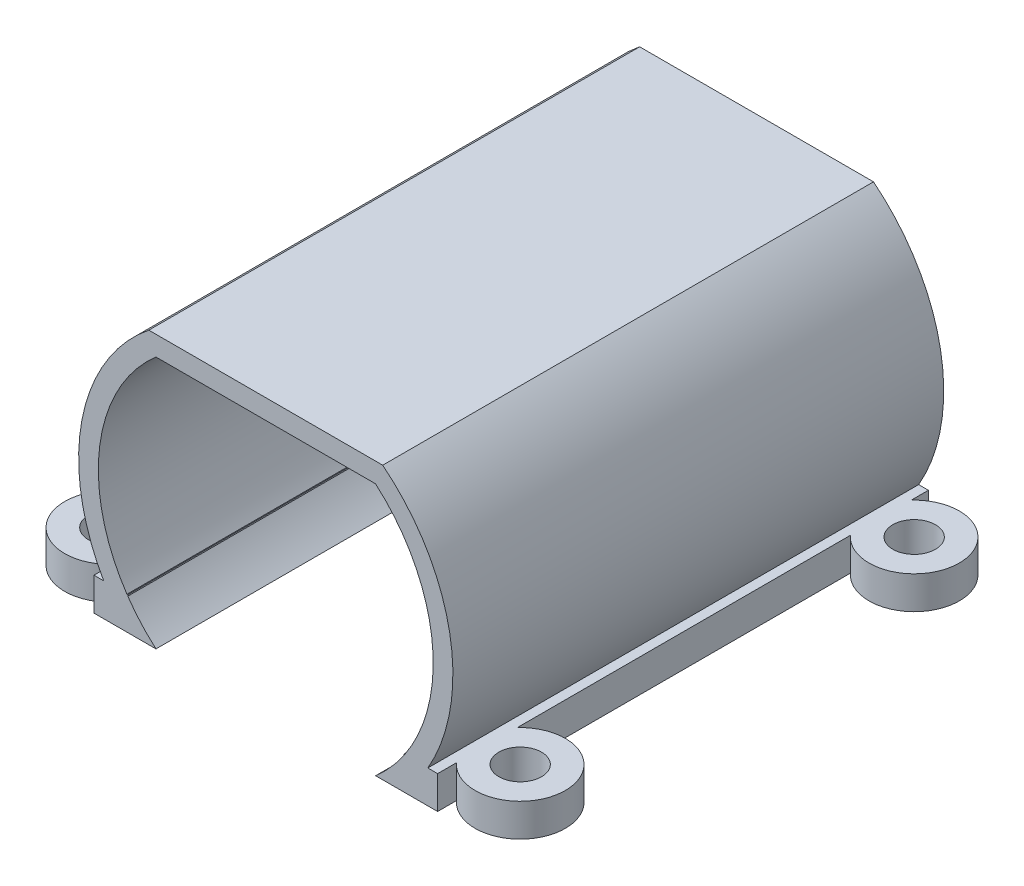
ISO-10303-21;
HEADER;
FILE_DESCRIPTION(('STEP AP214'),'2;1');
FILE_NAME('part.step','',(''),(''),'','','');
FILE_SCHEMA(('AUTOMOTIVE_DESIGN { 1 0 10303 214 1 1 1 1 }'));
ENDSEC;
DATA;
#1=APPLICATION_CONTEXT('core data for automotive mechanical design processes');
#2=APPLICATION_PROTOCOL_DEFINITION('international standard','automotive_design',2000,#1);
#3=PRODUCT_CONTEXT('',#1,'mechanical');
#4=PRODUCT('Part','Part','',(#3));
#5=PRODUCT_RELATED_PRODUCT_CATEGORY('part','',(#4));
#6=PRODUCT_DEFINITION_FORMATION('','',#4);
#7=PRODUCT_DEFINITION_CONTEXT('part definition',#1,'design');
#8=PRODUCT_DEFINITION('design','',#6,#7);
#9=PRODUCT_DEFINITION_SHAPE('','',#8);
#10=(LENGTH_UNIT() NAMED_UNIT(*) SI_UNIT(.MILLI.,.METRE.));
#11=(NAMED_UNIT(*) PLANE_ANGLE_UNIT() SI_UNIT($,.RADIAN.));
#12=(NAMED_UNIT(*) SI_UNIT($,.STERADIAN.) SOLID_ANGLE_UNIT());
#13=UNCERTAINTY_MEASURE_WITH_UNIT(LENGTH_MEASURE(1.E-05),#10,'distance_accuracy_value','');
#14=(GEOMETRIC_REPRESENTATION_CONTEXT(3) GLOBAL_UNCERTAINTY_ASSIGNED_CONTEXT((#13)) GLOBAL_UNIT_ASSIGNED_CONTEXT((#10,
#11,#12)) REPRESENTATION_CONTEXT('',''));
#15=CARTESIAN_POINT('',(0.,0.,0.));
#16=DIRECTION('',(0.,0.,1.));
#17=DIRECTION('',(1.,0.,0.));
#18=AXIS2_PLACEMENT_3D('',#15,#16,#17);
#19=CARTESIAN_POINT('',(0.,0.,30.));
#20=DIRECTION('',(0.,0.,-1.));
#21=DIRECTION('',(-1.,0.,0.));
#22=AXIS2_PLACEMENT_3D('',#19,#20,#21);
#23=CYLINDRICAL_SURFACE('',#22,11.4);
#24=DIRECTION('',(0.,0.,-1.));
#25=VECTOR('',#24,1.);
#26=CARTESIAN_POINT('',(9.8726896031426,-5.7,30.));
#27=LINE('',#26,#25);
#28=CARTESIAN_POINT('',(9.8726896031426,-5.7,30.));
#29=VERTEX_POINT('',#28);
#30=CARTESIAN_POINT('',(9.8726896031426,-5.7,0.0999999999999994));
#31=VERTEX_POINT('',#30);
#32=EDGE_CURVE('E11',#29,#31,#27,.T.);
#33=ORIENTED_EDGE('',*,*,#32,.T.);
#34=CARTESIAN_POINT('',(0.,0.,0.0999999999999994));
#35=DIRECTION('',(0.,0.,-1.));
#36=DIRECTION('',(-1.,0.,0.));
#37=AXIS2_PLACEMENT_3D('',#34,#35,#36);
#38=CIRCLE('',#37,11.4);
#39=CARTESIAN_POINT('',(7.1239034243875,8.9,0.0999999999999994));
#40=VERTEX_POINT('',#39);
#41=EDGE_CURVE('E218',#40,#31,#38,.T.);
#42=ORIENTED_EDGE('',*,*,#41,.F.);
#43=DIRECTION('',(0.,0.,-1.));
#44=VECTOR('',#43,1.);
#45=CARTESIAN_POINT('',(7.1239034243875,8.9,30.));
#46=LINE('',#45,#44);
#47=CARTESIAN_POINT('',(7.1239034243875,8.9,30.));
#48=VERTEX_POINT('',#47);
#49=EDGE_CURVE('E293',#48,#40,#46,.T.);
#50=ORIENTED_EDGE('',*,*,#49,.F.);
#51=CARTESIAN_POINT('',(0.,0.,30.));
#52=DIRECTION('',(0.,0.,1.));
#53=DIRECTION('',(1.,0.,0.));
#54=AXIS2_PLACEMENT_3D('',#51,#52,#53);
#55=CIRCLE('',#54,11.4);
#56=EDGE_CURVE('E292',#29,#48,#55,.T.);
#57=ORIENTED_EDGE('',*,*,#56,.F.);
#58=EDGE_LOOP('',(#33,#42,#50,#57));
#59=FACE_BOUND('',#58,.T.);
#60=ADVANCED_FACE('F37',(#59),#23,.T.);
#61=CARTESIAN_POINT('',(0.,0.,30.));
#62=DIRECTION('',(0.,0.,-1.));
#63=DIRECTION('',(-1.,0.,0.));
#64=AXIS2_PLACEMENT_3D('',#61,#62,#63);
#65=CYLINDRICAL_SURFACE('',#64,10.2);
#66=CARTESIAN_POINT('',(0.,0.,0.0999999999999994));
#67=DIRECTION('',(0.,0.,-1.));
#68=DIRECTION('',(-1.,0.,0.));
#69=AXIS2_PLACEMENT_3D('',#66,#67,#68);
#70=CIRCLE('',#69,10.2);
#71=CARTESIAN_POINT('',(6.68954408012983,7.7,0.0999999999999994));
#72=VERTEX_POINT('',#71);
#73=CARTESIAN_POINT('',(8.45872330792301,-5.7,0.0999999999999994));
#74=VERTEX_POINT('',#73);
#75=EDGE_CURVE('E250',#72,#74,#70,.T.);
#76=ORIENTED_EDGE('',*,*,#75,.T.);
#77=DIRECTION('',(0.,0.,-1.));
#78=VECTOR('',#77,1.);
#79=CARTESIAN_POINT('',(8.45872330792301,-5.7,30.));
#80=LINE('',#79,#78);
#81=CARTESIAN_POINT('',(8.45872330792301,-5.7,30.));
#82=VERTEX_POINT('',#81);
#83=EDGE_CURVE('E257',#74,#82,#80,.F.);
#84=ORIENTED_EDGE('',*,*,#83,.T.);
#85=CARTESIAN_POINT('',(0.,0.,30.));
#86=DIRECTION('',(0.,0.,1.));
#87=DIRECTION('',(1.,0.,0.));
#88=AXIS2_PLACEMENT_3D('',#85,#86,#87);
#89=CIRCLE('',#88,10.2);
#90=CARTESIAN_POINT('',(6.68954408012983,7.7,30.));
#91=VERTEX_POINT('',#90);
#92=EDGE_CURVE('E272',#82,#91,#89,.T.);
#93=ORIENTED_EDGE('',*,*,#92,.T.);
#94=DIRECTION('',(0.,0.,-1.));
#95=VECTOR('',#94,1.);
#96=CARTESIAN_POINT('',(6.68954408012983,7.7,30.));
#97=LINE('',#96,#95);
#98=EDGE_CURVE('E260',#91,#72,#97,.T.);
#99=ORIENTED_EDGE('',*,*,#98,.T.);
#100=EDGE_LOOP('',(#76,#84,#93,#99));
#101=FACE_BOUND('',#100,.T.);
#102=ADVANCED_FACE('F256',(#101),#65,.F.);
#103=CARTESIAN_POINT('',(-10.4676451259584,-5.7,0.0999999999999994));
#104=DIRECTION('',(-1.,0.,0.));
#105=DIRECTION('',(0.,0.,1.));
#106=AXIS2_PLACEMENT_3D('',#103,#104,#105);
#107=PLANE('',#106);
#108=DIRECTION('',(0.,-1.,0.));
#109=VECTOR('',#108,1.);
#110=CARTESIAN_POINT('',(-10.4676451259584,-5.7,1.14742512541077));
#111=LINE('',#110,#109);
#112=CARTESIAN_POINT('',(-10.4676451259584,-5.7,1.14742512541077));
#113=VERTEX_POINT('',#112);
#114=CARTESIAN_POINT('',(-10.4676451259584,-7.7,1.14742512541077));
#115=VERTEX_POINT('',#114);
#116=EDGE_CURVE('E405',#113,#115,#111,.T.);
#117=ORIENTED_EDGE('',*,*,#116,.F.);
#118=DIRECTION('',(0.,0.,-1.));
#119=VECTOR('',#118,1.);
#120=CARTESIAN_POINT('',(-10.4676451259584,-5.7,0.0999999999999994));
#121=LINE('',#120,#119);
#122=CARTESIAN_POINT('',(-10.4676451259584,-5.7,0.0999999999999994));
#123=VERTEX_POINT('',#122);
#124=EDGE_CURVE('E365',#113,#123,#121,.T.);
#125=ORIENTED_EDGE('',*,*,#124,.T.);
#126=DIRECTION('',(0.,-1.,0.));
#127=VECTOR('',#126,1.);
#128=CARTESIAN_POINT('',(-10.4676451259584,-5.7,0.0999999999999994));
#129=LINE('',#128,#127);
#130=CARTESIAN_POINT('',(-10.4676451259584,-7.7,0.0999999999999994));
#131=VERTEX_POINT('',#130);
#132=EDGE_CURVE('E351',#123,#131,#129,.T.);
#133=ORIENTED_EDGE('',*,*,#132,.T.);
#134=DIRECTION('',(0.,0.,-1.));
#135=VECTOR('',#134,1.);
#136=CARTESIAN_POINT('',(-10.4676451259584,-7.7,0.0999999999999994));
#137=LINE('',#136,#135);
#138=EDGE_CURVE('E314',#115,#131,#137,.T.);
#139=ORIENTED_EDGE('',*,*,#138,.F.);
#140=EDGE_LOOP('',(#117,#125,#133,#139));
#141=FACE_BOUND('',#140,.T.);
#142=ADVANCED_FACE('F479',(#141),#107,.T.);
#143=DIRECTION('',(0.,-1.,0.));
#144=VECTOR('',#143,1.);
#145=CARTESIAN_POINT('',(-10.4676451259584,-5.7,4.85257487458923));
#146=LINE('',#145,#144);
#147=CARTESIAN_POINT('',(-10.4676451259584,-7.7,4.85257487458923));
#148=VERTEX_POINT('',#147);
#149=CARTESIAN_POINT('',(-10.4676451259584,-5.7,4.85257487458923));
#150=VERTEX_POINT('',#149);
#151=EDGE_CURVE('E410',#148,#150,#146,.F.);
#152=ORIENTED_EDGE('',*,*,#151,.F.);
#153=CARTESIAN_POINT('',(-10.4676451259584,-7.7,25.1474251254108));
#154=VERTEX_POINT('',#153);
#155=EDGE_CURVE('E357',#154,#148,#137,.T.);
#156=ORIENTED_EDGE('',*,*,#155,.F.);
#157=DIRECTION('',(0.,-1.,0.));
#158=VECTOR('',#157,1.);
#159=CARTESIAN_POINT('',(-10.4676451259584,-5.7,25.1474251254108));
#160=LINE('',#159,#158);
#161=CARTESIAN_POINT('',(-10.4676451259584,-5.7,25.1474251254108));
#162=VERTEX_POINT('',#161);
#163=EDGE_CURVE('E390',#162,#154,#160,.T.);
#164=ORIENTED_EDGE('',*,*,#163,.F.);
#165=EDGE_CURVE('E364',#162,#150,#121,.T.);
#166=ORIENTED_EDGE('',*,*,#165,.T.);
#167=EDGE_LOOP('',(#152,#156,#164,#166));
#168=FACE_BOUND('',#167,.T.);
#169=ADVANCED_FACE('F472',(#168),#107,.T.);
#170=CARTESIAN_POINT('',(0.,0.,30.));
#171=DIRECTION('',(0.,0.,-1.));
#172=DIRECTION('',(-1.,0.,0.));
#173=AXIS2_PLACEMENT_3D('',#170,#171,#172);
#174=CYLINDRICAL_SURFACE('',#173,11.4);
#175=DIRECTION('',(0.,0.,-1.));
#176=VECTOR('',#175,1.);
#177=CARTESIAN_POINT('',(-9.8726896031426,-5.7,30.));
#178=LINE('',#177,#176);
#179=CARTESIAN_POINT('',(-9.8726896031426,-5.7,30.));
#180=VERTEX_POINT('',#179);
#181=CARTESIAN_POINT('',(-9.8726896031426,-5.7,0.0999999999999994));
#182=VERTEX_POINT('',#181);
#183=EDGE_CURVE('E340',#180,#182,#178,.T.);
#184=ORIENTED_EDGE('',*,*,#183,.F.);
#185=CARTESIAN_POINT('',(0.,0.,30.));
#186=DIRECTION('',(0.,0.,1.));
#187=DIRECTION('',(1.,0.,0.));
#188=AXIS2_PLACEMENT_3D('',#185,#186,#187);
#189=CIRCLE('',#188,11.4);
#190=CARTESIAN_POINT('',(-7.12390342438751,8.9,30.));
#191=VERTEX_POINT('',#190);
#192=EDGE_CURVE('E300',#191,#180,#189,.T.);
#193=ORIENTED_EDGE('',*,*,#192,.F.);
#194=DIRECTION('',(0.,0.,-1.));
#195=VECTOR('',#194,1.);
#196=CARTESIAN_POINT('',(-7.12390342438751,8.9,30.));
#197=LINE('',#196,#195);
#198=CARTESIAN_POINT('',(-7.12390342438751,8.9,0.0999999999999994));
#199=VERTEX_POINT('',#198);
#200=EDGE_CURVE('E297',#191,#199,#197,.T.);
#201=ORIENTED_EDGE('',*,*,#200,.T.);
#202=CARTESIAN_POINT('',(0.,0.,0.0999999999999994));
#203=DIRECTION('',(0.,0.,-1.));
#204=DIRECTION('',(-1.,0.,0.));
#205=AXIS2_PLACEMENT_3D('',#202,#203,#204);
#206=CIRCLE('',#205,11.4);
#207=EDGE_CURVE('E261',#182,#199,#206,.T.);
#208=ORIENTED_EDGE('',*,*,#207,.F.);
#209=EDGE_LOOP('',(#184,#193,#201,#208));
#210=FACE_BOUND('',#209,.T.);
#211=ADVANCED_FACE('F39',(#210),#174,.T.);
#212=CARTESIAN_POINT('',(0.,0.,30.));
#213=DIRECTION('',(0.,0.,-1.));
#214=DIRECTION('',(-1.,0.,0.));
#215=AXIS2_PLACEMENT_3D('',#212,#213,#214);
#216=CYLINDRICAL_SURFACE('',#215,10.2);
#217=CARTESIAN_POINT('',(0.,0.,30.));
#218=DIRECTION('',(0.,0.,1.));
#219=DIRECTION('',(1.,0.,0.));
#220=AXIS2_PLACEMENT_3D('',#217,#218,#219);
#221=CIRCLE('',#220,10.2);
#222=CARTESIAN_POINT('',(-6.68954408012983,7.7,30.));
#223=VERTEX_POINT('',#222);
#224=CARTESIAN_POINT('',(-8.45872330792301,-5.7,30.));
#225=VERTEX_POINT('',#224);
#226=EDGE_CURVE('E279',#223,#225,#221,.T.);
#227=ORIENTED_EDGE('',*,*,#226,.T.);
#228=DIRECTION('',(0.,0.,-1.));
#229=VECTOR('',#228,1.);
#230=CARTESIAN_POINT('',(-8.45872330792301,-5.7,30.));
#231=LINE('',#230,#229);
#232=CARTESIAN_POINT('',(-8.45872330792301,-5.7,0.0999999999999994));
#233=VERTEX_POINT('',#232);
#234=EDGE_CURVE('E342',#225,#233,#231,.T.);
#235=ORIENTED_EDGE('',*,*,#234,.T.);
#236=CARTESIAN_POINT('',(0.,0.,0.0999999999999994));
#237=DIRECTION('',(0.,0.,-1.));
#238=DIRECTION('',(-1.,0.,0.));
#239=AXIS2_PLACEMENT_3D('',#236,#237,#238);
#240=CIRCLE('',#239,10.2);
#241=CARTESIAN_POINT('',(-6.68954408012983,7.7,0.0999999999999994));
#242=VERTEX_POINT('',#241);
#243=EDGE_CURVE('E324',#233,#242,#240,.T.);
#244=ORIENTED_EDGE('',*,*,#243,.T.);
#245=DIRECTION('',(0.,0.,-1.));
#246=VECTOR('',#245,1.);
#247=CARTESIAN_POINT('',(-6.68954408012983,7.7,30.));
#248=LINE('',#247,#246);
#249=EDGE_CURVE('E288',#223,#242,#248,.T.);
#250=ORIENTED_EDGE('',*,*,#249,.F.);
#251=EDGE_LOOP('',(#227,#235,#244,#250));
#252=FACE_BOUND('',#251,.T.);
#253=ADVANCED_FACE('F481',(#252),#216,.F.);
#254=CARTESIAN_POINT('',(-6.68954408012983,8.9,30.));
#255=DIRECTION('',(0.,-1.,0.));
#256=DIRECTION('',(1.,0.,0.));
#257=AXIS2_PLACEMENT_3D('',#254,#255,#256);
#258=PLANE('',#257);
#259=DIRECTION('',(1.,0.,0.));
#260=VECTOR('',#259,1.);
#261=CARTESIAN_POINT('',(-6.68954408012983,8.9,0.0999999999999994));
#262=LINE('',#261,#260);
#263=EDGE_CURVE('E264',#199,#40,#262,.T.);
#264=ORIENTED_EDGE('',*,*,#263,.F.);
#265=ORIENTED_EDGE('',*,*,#200,.F.);
#266=DIRECTION('',(-1.,0.,0.));
#267=VECTOR('',#266,1.);
#268=CARTESIAN_POINT('',(-6.68954408012983,8.9,30.));
#269=LINE('',#268,#267);
#270=EDGE_CURVE('E302',#48,#191,#269,.T.);
#271=ORIENTED_EDGE('',*,*,#270,.F.);
#272=ORIENTED_EDGE('',*,*,#49,.T.);
#273=EDGE_LOOP('',(#264,#265,#271,#272));
#274=FACE_BOUND('',#273,.T.);
#275=ADVANCED_FACE('F449',(#274),#258,.F.);
#276=DIRECTION('',(0.,0.,-1.));
#277=VECTOR('',#276,1.);
#278=CARTESIAN_POINT('',(8.4065450691708,-5.77667724561447,30.));
#279=LINE('',#278,#277);
#280=CARTESIAN_POINT('',(8.4065450691708,-5.77667724561447,0.0999999999999994));
#281=VERTEX_POINT('',#280);
#282=CARTESIAN_POINT('',(8.4065450691708,-5.77667724561447,30.));
#283=VERTEX_POINT('',#282);
#284=EDGE_CURVE('E420',#281,#283,#279,.F.);
#285=ORIENTED_EDGE('',*,*,#284,.F.);
#286=CARTESIAN_POINT('',(6.68954408012982,-7.7,0.0999999999999994));
#287=VERTEX_POINT('',#286);
#288=EDGE_CURVE('E262',#281,#287,#70,.T.);
#289=ORIENTED_EDGE('',*,*,#288,.T.);
#290=DIRECTION('',(0.,0.,-1.));
#291=VECTOR('',#290,1.);
#292=CARTESIAN_POINT('',(6.68954408012982,-7.7,30.));
#293=LINE('',#292,#291);
#294=CARTESIAN_POINT('',(6.68954408012982,-7.7,30.));
#295=VERTEX_POINT('',#294);
#296=EDGE_CURVE('E282',#295,#287,#293,.T.);
#297=ORIENTED_EDGE('',*,*,#296,.F.);
#298=EDGE_CURVE('E273',#295,#283,#89,.T.);
#299=ORIENTED_EDGE('',*,*,#298,.T.);
#300=EDGE_LOOP('',(#285,#289,#297,#299));
#301=FACE_BOUND('',#300,.T.);
#302=ADVANCED_FACE('F495',(#301),#65,.F.);
#303=CARTESIAN_POINT('',(-6.68954408012983,7.7,30.));
#304=DIRECTION('',(0.,-1.,0.));
#305=DIRECTION('',(1.,0.,0.));
#306=AXIS2_PLACEMENT_3D('',#303,#304,#305);
#307=PLANE('',#306);
#308=ORIENTED_EDGE('',*,*,#249,.T.);
#309=DIRECTION('',(1.,0.,0.));
#310=VECTOR('',#309,1.);
#311=CARTESIAN_POINT('',(-6.68954408012983,7.7,0.0999999999999994));
#312=LINE('',#311,#310);
#313=EDGE_CURVE('E266',#242,#72,#312,.T.);
#314=ORIENTED_EDGE('',*,*,#313,.T.);
#315=ORIENTED_EDGE('',*,*,#98,.F.);
#316=DIRECTION('',(-1.,0.,0.));
#317=VECTOR('',#316,1.);
#318=CARTESIAN_POINT('',(-6.68954408012983,7.7,30.));
#319=LINE('',#318,#317);
#320=EDGE_CURVE('E276',#91,#223,#319,.T.);
#321=ORIENTED_EDGE('',*,*,#320,.T.);
#322=EDGE_LOOP('',(#308,#314,#315,#321));
#323=FACE_BOUND('',#322,.T.);
#324=ADVANCED_FACE('F501',(#323),#307,.T.);
#325=DIRECTION('',(0.,0.,-1.));
#326=VECTOR('',#325,1.);
#327=CARTESIAN_POINT('',(-8.4065450691708,-5.77667724561447,30.));
#328=LINE('',#327,#326);
#329=CARTESIAN_POINT('',(-8.4065450691708,-5.77667724561447,30.));
#330=VERTEX_POINT('',#329);
#331=CARTESIAN_POINT('',(-8.4065450691708,-5.77667724561447,0.0999999999999994));
#332=VERTEX_POINT('',#331);
#333=EDGE_CURVE('E327',#330,#332,#328,.T.);
#334=ORIENTED_EDGE('',*,*,#333,.F.);
#335=CARTESIAN_POINT('',(-6.68954408012983,-7.7,30.));
#336=VERTEX_POINT('',#335);
#337=EDGE_CURVE('E278',#330,#336,#221,.T.);
#338=ORIENTED_EDGE('',*,*,#337,.T.);
#339=DIRECTION('',(0.,0.,-1.));
#340=VECTOR('',#339,1.);
#341=CARTESIAN_POINT('',(-6.68954408012982,-7.7,30.));
#342=LINE('',#341,#340);
#343=CARTESIAN_POINT('',(-6.68954408012982,-7.7,0.0999999999999994));
#344=VERTEX_POINT('',#343);
#345=EDGE_CURVE('E285',#336,#344,#342,.T.);
#346=ORIENTED_EDGE('',*,*,#345,.T.);
#347=EDGE_CURVE('E319',#344,#332,#240,.T.);
#348=ORIENTED_EDGE('',*,*,#347,.T.);
#349=EDGE_LOOP('',(#334,#338,#346,#348));
#350=FACE_BOUND('',#349,.T.);
#351=ADVANCED_FACE('F325',(#350),#216,.F.);
#352=CARTESIAN_POINT('',(0.,0.,30.));
#353=DIRECTION('',(0.,0.,1.));
#354=DIRECTION('',(1.,0.,0.));
#355=AXIS2_PLACEMENT_3D('',#352,#353,#354);
#356=PLANE('',#355);
#357=DIRECTION('',(-1.,0.,0.));
#358=VECTOR('',#357,1.);
#359=CARTESIAN_POINT('',(9.30983296214352,-7.7,30.));
#360=LINE('',#359,#358);
#361=CARTESIAN_POINT('',(10.4676451259584,-7.7,30.));
#362=VERTEX_POINT('',#361);
#363=EDGE_CURVE('E339',#362,#295,#360,.T.);
#364=ORIENTED_EDGE('',*,*,#363,.F.);
#365=DIRECTION('',(0.,-1.,0.));
#366=VECTOR('',#365,1.);
#367=CARTESIAN_POINT('',(10.4676451259584,-5.7,30.));
#368=LINE('',#367,#366);
#369=CARTESIAN_POINT('',(10.4676451259584,-5.7,30.));
#370=VERTEX_POINT('',#369);
#371=EDGE_CURVE('E227',#370,#362,#368,.T.);
#372=ORIENTED_EDGE('',*,*,#371,.F.);
#373=DIRECTION('',(-1.,0.,0.));
#374=VECTOR('',#373,1.);
#375=CARTESIAN_POINT('',(8.4065450691708,-5.7,30.));
#376=LINE('',#375,#374);
#377=EDGE_CURVE('E240',#370,#29,#376,.T.);
#378=ORIENTED_EDGE('',*,*,#377,.T.);
#379=ORIENTED_EDGE('',*,*,#56,.T.);
#380=ORIENTED_EDGE('',*,*,#270,.T.);
#381=ORIENTED_EDGE('',*,*,#192,.T.);
#382=DIRECTION('',(-1.,0.,0.));
#383=VECTOR('',#382,1.);
#384=CARTESIAN_POINT('',(-8.4065450691708,-5.7,30.));
#385=LINE('',#384,#383);
#386=CARTESIAN_POINT('',(-10.4676451259584,-5.7,30.));
#387=VERTEX_POINT('',#386);
#388=EDGE_CURVE('E368',#180,#387,#385,.T.);
#389=ORIENTED_EDGE('',*,*,#388,.T.);
#390=DIRECTION('',(0.,-1.,0.));
#391=VECTOR('',#390,1.);
#392=CARTESIAN_POINT('',(-10.4676451259584,-5.7,30.));
#393=LINE('',#392,#391);
#394=CARTESIAN_POINT('',(-10.4676451259584,-7.7,30.));
#395=VERTEX_POINT('',#394);
#396=EDGE_CURVE('E336',#387,#395,#393,.T.);
#397=ORIENTED_EDGE('',*,*,#396,.T.);
#398=EDGE_CURVE('E334',#336,#395,#360,.T.);
#399=ORIENTED_EDGE('',*,*,#398,.F.);
#400=ORIENTED_EDGE('',*,*,#337,.F.);
#401=DIRECTION('',(0.,-1.,0.));
#402=VECTOR('',#401,1.);
#403=CARTESIAN_POINT('',(-8.4065450691708,-5.7,30.));
#404=LINE('',#403,#402);
#405=CARTESIAN_POINT('',(-8.4065450691708,-5.7,30.));
#406=VERTEX_POINT('',#405);
#407=EDGE_CURVE('E331',#406,#330,#404,.T.);
#408=ORIENTED_EDGE('',*,*,#407,.F.);
#409=EDGE_CURVE('E366',#406,#225,#385,.T.);
#410=ORIENTED_EDGE('',*,*,#409,.T.);
#411=ORIENTED_EDGE('',*,*,#226,.F.);
#412=ORIENTED_EDGE('',*,*,#320,.F.);
#413=ORIENTED_EDGE('',*,*,#92,.F.);
#414=CARTESIAN_POINT('',(8.4065450691708,-5.7,30.));
#415=VERTEX_POINT('',#414);
#416=EDGE_CURVE('E52',#82,#415,#376,.T.);
#417=ORIENTED_EDGE('',*,*,#416,.T.);
#418=DIRECTION('',(0.,-1.,0.));
#419=VECTOR('',#418,1.);
#420=CARTESIAN_POINT('',(8.4065450691708,-5.7,30.));
#421=LINE('',#420,#419);
#422=EDGE_CURVE('E434',#415,#283,#421,.T.);
#423=ORIENTED_EDGE('',*,*,#422,.T.);
#424=ORIENTED_EDGE('',*,*,#298,.F.);
#425=EDGE_LOOP('',(#364,#372,#378,#379,#380,#381,#389,#397,#399,#400,#408,#410,#411,#412,#413,
#417,#423,#424));
#426=FACE_BOUND('',#425,.T.);
#427=ADVANCED_FACE('F329',(#426),#356,.T.);
#428=CARTESIAN_POINT('',(0.,0.,0.1));
#429=DIRECTION('',(0.,0.,-1.));
#430=DIRECTION('',(-1.,0.,0.));
#431=AXIS2_PLACEMENT_3D('',#428,#429,#430);
#432=PLANE('',#431);
#433=ORIENTED_EDGE('',*,*,#288,.F.);
#434=DIRECTION('',(0.,-1.,0.));
#435=VECTOR('',#434,1.);
#436=CARTESIAN_POINT('',(8.4065450691708,-5.7,0.0999999999999994));
#437=LINE('',#436,#435);
#438=CARTESIAN_POINT('',(8.4065450691708,-5.7,0.0999999999999994));
#439=VERTEX_POINT('',#438);
#440=EDGE_CURVE('E252',#439,#281,#437,.T.);
#441=ORIENTED_EDGE('',*,*,#440,.F.);
#442=DIRECTION('',(1.,0.,0.));
#443=VECTOR('',#442,1.);
#444=CARTESIAN_POINT('',(8.4065450691708,-5.7,0.0999999999999994));
#445=LINE('',#444,#443);
#446=EDGE_CURVE('E221',#439,#74,#445,.T.);
#447=ORIENTED_EDGE('',*,*,#446,.T.);
#448=ORIENTED_EDGE('',*,*,#75,.F.);
#449=ORIENTED_EDGE('',*,*,#313,.F.);
#450=ORIENTED_EDGE('',*,*,#243,.F.);
#451=DIRECTION('',(1.,0.,0.));
#452=VECTOR('',#451,1.);
#453=CARTESIAN_POINT('',(-8.4065450691708,-5.7,0.0999999999999994));
#454=LINE('',#453,#452);
#455=CARTESIAN_POINT('',(-8.4065450691708,-5.7,0.0999999999999994));
#456=VERTEX_POINT('',#455);
#457=EDGE_CURVE('E360',#233,#456,#454,.T.);
#458=ORIENTED_EDGE('',*,*,#457,.T.);
#459=DIRECTION('',(0.,-1.,0.));
#460=VECTOR('',#459,1.);
#461=CARTESIAN_POINT('',(-8.4065450691708,-5.7,0.0999999999999994));
#462=LINE('',#461,#460);
#463=EDGE_CURVE('E321',#456,#332,#462,.T.);
#464=ORIENTED_EDGE('',*,*,#463,.T.);
#465=ORIENTED_EDGE('',*,*,#347,.F.);
#466=DIRECTION('',(1.,0.,0.));
#467=VECTOR('',#466,1.);
#468=CARTESIAN_POINT('',(0.,-7.7,0.1));
#469=LINE('',#468,#467);
#470=EDGE_CURVE('E45',#131,#344,#469,.T.);
#471=ORIENTED_EDGE('',*,*,#470,.F.);
#472=ORIENTED_EDGE('',*,*,#132,.F.);
#473=EDGE_CURVE('E349',#123,#182,#454,.T.);
#474=ORIENTED_EDGE('',*,*,#473,.T.);
#475=ORIENTED_EDGE('',*,*,#207,.T.);
#476=ORIENTED_EDGE('',*,*,#263,.T.);
#477=ORIENTED_EDGE('',*,*,#41,.T.);
#478=CARTESIAN_POINT('',(10.4676451259584,-5.7,0.0999999999999994));
#479=VERTEX_POINT('',#478);
#480=EDGE_CURVE('E211',#31,#479,#445,.T.);
#481=ORIENTED_EDGE('',*,*,#480,.T.);
#482=DIRECTION('',(0.,-1.,0.));
#483=VECTOR('',#482,1.);
#484=CARTESIAN_POINT('',(10.4676451259584,-5.7,0.0999999999999994));
#485=LINE('',#484,#483);
#486=CARTESIAN_POINT('',(10.4676451259584,-7.7,0.0999999999999994));
#487=VERTEX_POINT('',#486);
#488=EDGE_CURVE('E216',#479,#487,#485,.T.);
#489=ORIENTED_EDGE('',*,*,#488,.T.);
#490=EDGE_CURVE('E296',#287,#487,#469,.T.);
#491=ORIENTED_EDGE('',*,*,#490,.F.);
#492=EDGE_LOOP('',(#433,#441,#447,#448,#449,#450,#458,#464,#465,#471,#472,#474,#475,#476,#477,
#481,#489,#491));
#493=FACE_BOUND('',#492,.T.);
#494=ADVANCED_FACE('F214',(#493),#432,.T.);
#495=CARTESIAN_POINT('',(9.30983296214352,-7.7,-18.3));
#496=DIRECTION('',(0.,1.,0.));
#497=DIRECTION('',(0.,0.,1.));
#498=AXIS2_PLACEMENT_3D('',#495,#496,#497);
#499=PLANE('',#498);
#500=ORIENTED_EDGE('',*,*,#296,.T.);
#501=ORIENTED_EDGE('',*,*,#490,.T.);
#502=DIRECTION('',(0.,0.,1.));
#503=VECTOR('',#502,1.);
#504=CARTESIAN_POINT('',(10.4676451259584,-7.7,0.0999999999999994));
#505=LINE('',#504,#503);
#506=CARTESIAN_POINT('',(10.4676451259584,-7.7,1.14742512541077));
#507=VERTEX_POINT('',#506);
#508=EDGE_CURVE('E60',#487,#507,#505,.T.);
#509=ORIENTED_EDGE('',*,*,#508,.T.);
#510=CARTESIAN_POINT('',(12.5,-7.7,3.));
#511=DIRECTION('',(0.,-1.,0.));
#512=DIRECTION('',(0.,0.,-1.));
#513=AXIS2_PLACEMENT_3D('',#510,#511,#512);
#514=CIRCLE('',#513,2.75);
#515=CARTESIAN_POINT('',(10.4676451259584,-7.7,4.85257487458923));
#516=VERTEX_POINT('',#515);
#517=EDGE_CURVE('E383',#507,#516,#514,.T.);
#518=ORIENTED_EDGE('',*,*,#517,.T.);
#519=CARTESIAN_POINT('',(10.4676451259584,-7.7,25.1474251254108));
#520=VERTEX_POINT('',#519);
#521=EDGE_CURVE('E439',#516,#520,#505,.T.);
#522=ORIENTED_EDGE('',*,*,#521,.T.);
#523=CARTESIAN_POINT('',(12.5,-7.7,27.));
#524=DIRECTION('',(0.,-1.,0.));
#525=DIRECTION('',(0.,0.,1.));
#526=AXIS2_PLACEMENT_3D('',#523,#524,#525);
#527=CIRCLE('',#526,2.75);
#528=CARTESIAN_POINT('',(10.4676451259584,-7.7,28.8525748745892));
#529=VERTEX_POINT('',#528);
#530=EDGE_CURVE('E371',#520,#529,#527,.T.);
#531=ORIENTED_EDGE('',*,*,#530,.T.);
#532=EDGE_CURVE('E440',#529,#362,#505,.T.);
#533=ORIENTED_EDGE('',*,*,#532,.T.);
#534=ORIENTED_EDGE('',*,*,#363,.T.);
#535=EDGE_LOOP('',(#500,#501,#509,#518,#522,#531,#533,#534));
#536=FACE_BOUND('',#535,.T.);
#537=CARTESIAN_POINT('',(12.5,-7.7,27.));
#538=DIRECTION('',(0.,-1.,0.));
#539=DIRECTION('',(0.,0.,1.));
#540=AXIS2_PLACEMENT_3D('',#537,#538,#539);
#541=CIRCLE('',#540,1.3);
#542=CARTESIAN_POINT('',(12.5,-7.7,28.3));
#543=VERTEX_POINT('',#542);
#544=EDGE_CURVE('E378',#543,#543,#541,.T.);
#545=ORIENTED_EDGE('',*,*,#544,.F.);
#546=EDGE_LOOP('',(#545));
#547=FACE_BOUND('',#546,.T.);
#548=CARTESIAN_POINT('',(12.5,-7.7,3.));
#549=DIRECTION('',(0.,-1.,0.));
#550=DIRECTION('',(0.,0.,-1.));
#551=AXIS2_PLACEMENT_3D('',#548,#549,#550);
#552=CIRCLE('',#551,1.3);
#553=CARTESIAN_POINT('',(12.5,-7.7,1.7));
#554=VERTEX_POINT('',#553);
#555=EDGE_CURVE('E387',#554,#554,#552,.T.);
#556=ORIENTED_EDGE('',*,*,#555,.F.);
#557=EDGE_LOOP('',(#556));
#558=FACE_BOUND('',#557,.T.);
#559=ADVANCED_FACE('F513',(#536,#547,#558),#499,.F.);
#560=ORIENTED_EDGE('',*,*,#155,.T.);
#561=CARTESIAN_POINT('',(-12.5,-7.7,3.));
#562=DIRECTION('',(0.,-1.,0.));
#563=DIRECTION('',(0.,0.,1.));
#564=AXIS2_PLACEMENT_3D('',#561,#562,#563);
#565=CIRCLE('',#564,2.75);
#566=EDGE_CURVE('E413',#148,#115,#565,.T.);
#567=ORIENTED_EDGE('',*,*,#566,.T.);
#568=ORIENTED_EDGE('',*,*,#138,.T.);
#569=ORIENTED_EDGE('',*,*,#470,.T.);
#570=ORIENTED_EDGE('',*,*,#345,.F.);
#571=ORIENTED_EDGE('',*,*,#398,.T.);
#572=CARTESIAN_POINT('',(-10.4676451259584,-7.7,28.8525748745892));
#573=VERTEX_POINT('',#572);
#574=EDGE_CURVE('E354',#395,#573,#137,.T.);
#575=ORIENTED_EDGE('',*,*,#574,.T.);
#576=CARTESIAN_POINT('',(-12.5,-7.7,27.));
#577=DIRECTION('',(0.,-1.,0.));
#578=DIRECTION('',(0.,0.,-1.));
#579=AXIS2_PLACEMENT_3D('',#576,#577,#578);
#580=CIRCLE('',#579,2.75);
#581=EDGE_CURVE('E398',#573,#154,#580,.T.);
#582=ORIENTED_EDGE('',*,*,#581,.T.);
#583=EDGE_LOOP('',(#560,#567,#568,#569,#570,#571,#575,#582));
#584=FACE_BOUND('',#583,.T.);
#585=CARTESIAN_POINT('',(-12.5,-7.7,27.));
#586=DIRECTION('',(0.,-1.,0.));
#587=DIRECTION('',(0.,0.,-1.));
#588=AXIS2_PLACEMENT_3D('',#585,#586,#587);
#589=CIRCLE('',#588,1.3);
#590=CARTESIAN_POINT('',(-12.5,-7.7,25.7));
#591=VERTEX_POINT('',#590);
#592=EDGE_CURVE('E402',#591,#591,#589,.T.);
#593=ORIENTED_EDGE('',*,*,#592,.F.);
#594=EDGE_LOOP('',(#593));
#595=FACE_BOUND('',#594,.T.);
#596=CARTESIAN_POINT('',(-12.5,-7.7,3.));
#597=DIRECTION('',(0.,-1.,0.));
#598=DIRECTION('',(0.,0.,1.));
#599=AXIS2_PLACEMENT_3D('',#596,#597,#598);
#600=CIRCLE('',#599,1.3);
#601=CARTESIAN_POINT('',(-12.5,-7.7,4.3));
#602=VERTEX_POINT('',#601);
#603=EDGE_CURVE('E417',#602,#602,#600,.T.);
#604=ORIENTED_EDGE('',*,*,#603,.F.);
#605=EDGE_LOOP('',(#604));
#606=FACE_BOUND('',#605,.T.);
#607=ADVANCED_FACE('F310',(#584,#595,#606),#499,.F.);
#608=DIRECTION('',(0.,-1.,0.));
#609=VECTOR('',#608,1.);
#610=CARTESIAN_POINT('',(-10.4676451259584,-5.7,28.8525748745892));
#611=LINE('',#610,#609);
#612=CARTESIAN_POINT('',(-10.4676451259584,-5.7,28.8525748745892));
#613=VERTEX_POINT('',#612);
#614=EDGE_CURVE('E395',#573,#613,#611,.F.);
#615=ORIENTED_EDGE('',*,*,#614,.F.);
#616=ORIENTED_EDGE('',*,*,#574,.F.);
#617=ORIENTED_EDGE('',*,*,#396,.F.);
#618=EDGE_CURVE('E361',#387,#613,#121,.T.);
#619=ORIENTED_EDGE('',*,*,#618,.T.);
#620=EDGE_LOOP('',(#615,#616,#617,#619));
#621=FACE_BOUND('',#620,.T.);
#622=ADVANCED_FACE('F464',(#621),#107,.T.);
#623=CARTESIAN_POINT('',(0.,-5.7,0.));
#624=DIRECTION('',(0.,-1.,0.));
#625=DIRECTION('',(0.,0.,-1.));
#626=AXIS2_PLACEMENT_3D('',#623,#624,#625);
#627=PLANE('',#626);
#628=ORIENTED_EDGE('',*,*,#183,.T.);
#629=ORIENTED_EDGE('',*,*,#473,.F.);
#630=ORIENTED_EDGE('',*,*,#124,.F.);
#631=CARTESIAN_POINT('',(-12.5,-5.7,3.));
#632=DIRECTION('',(0.,-1.,0.));
#633=DIRECTION('',(0.,0.,1.));
#634=AXIS2_PLACEMENT_3D('',#631,#632,#633);
#635=CIRCLE('',#634,2.75);
#636=EDGE_CURVE('E412',#150,#113,#635,.T.);
#637=ORIENTED_EDGE('',*,*,#636,.F.);
#638=ORIENTED_EDGE('',*,*,#165,.F.);
#639=CARTESIAN_POINT('',(-12.5,-5.7,27.));
#640=DIRECTION('',(0.,-1.,0.));
#641=DIRECTION('',(0.,0.,-1.));
#642=AXIS2_PLACEMENT_3D('',#639,#640,#641);
#643=CIRCLE('',#642,2.75);
#644=EDGE_CURVE('E397',#613,#162,#643,.T.);
#645=ORIENTED_EDGE('',*,*,#644,.F.);
#646=ORIENTED_EDGE('',*,*,#618,.F.);
#647=ORIENTED_EDGE('',*,*,#388,.F.);
#648=EDGE_LOOP('',(#628,#629,#630,#637,#638,#645,#646,#647));
#649=FACE_BOUND('',#648,.T.);
#650=CARTESIAN_POINT('',(-12.5,-5.7,27.));
#651=DIRECTION('',(0.,-1.,0.));
#652=DIRECTION('',(0.,0.,-1.));
#653=AXIS2_PLACEMENT_3D('',#650,#651,#652);
#654=CIRCLE('',#653,1.3);
#655=CARTESIAN_POINT('',(-12.5,-5.7,25.7));
#656=VERTEX_POINT('',#655);
#657=EDGE_CURVE('E400',#656,#656,#654,.T.);
#658=ORIENTED_EDGE('',*,*,#657,.T.);
#659=EDGE_LOOP('',(#658));
#660=FACE_BOUND('',#659,.T.);
#661=CARTESIAN_POINT('',(-12.5,-5.7,3.));
#662=DIRECTION('',(0.,-1.,0.));
#663=DIRECTION('',(0.,0.,1.));
#664=AXIS2_PLACEMENT_3D('',#661,#662,#663);
#665=CIRCLE('',#664,1.3);
#666=CARTESIAN_POINT('',(-12.5,-5.7,4.3));
#667=VERTEX_POINT('',#666);
#668=EDGE_CURVE('E415',#667,#667,#665,.T.);
#669=ORIENTED_EDGE('',*,*,#668,.T.);
#670=EDGE_LOOP('',(#669));
#671=FACE_BOUND('',#670,.T.);
#672=ADVANCED_FACE('F456',(#649,#660,#671),#627,.F.);
#673=CARTESIAN_POINT('',(-8.4065450691708,-5.7,0.0999999999999994));
#674=DIRECTION('',(1.,0.,0.));
#675=DIRECTION('',(0.,0.,-1.));
#676=AXIS2_PLACEMENT_3D('',#673,#674,#675);
#677=PLANE('',#676);
#678=ORIENTED_EDGE('',*,*,#407,.T.);
#679=ORIENTED_EDGE('',*,*,#333,.T.);
#680=ORIENTED_EDGE('',*,*,#463,.F.);
#681=DIRECTION('',(0.,0.,1.));
#682=VECTOR('',#681,1.);
#683=CARTESIAN_POINT('',(-8.4065450691708,-5.7,0.0999999999999994));
#684=LINE('',#683,#682);
#685=EDGE_CURVE('E356',#456,#406,#684,.T.);
#686=ORIENTED_EDGE('',*,*,#685,.T.);
#687=EDGE_LOOP('',(#678,#679,#680,#686));
#688=FACE_BOUND('',#687,.T.);
#689=ADVANCED_FACE('F516',(#688),#677,.T.);
#690=ORIENTED_EDGE('',*,*,#234,.F.);
#691=ORIENTED_EDGE('',*,*,#409,.F.);
#692=ORIENTED_EDGE('',*,*,#685,.F.);
#693=ORIENTED_EDGE('',*,*,#457,.F.);
#694=EDGE_LOOP('',(#690,#691,#692,#693));
#695=FACE_BOUND('',#694,.T.);
#696=ADVANCED_FACE('F518',(#695),#627,.F.);
#697=CARTESIAN_POINT('',(12.5,-5.7,27.));
#698=DIRECTION('',(0.,-1.,0.));
#699=DIRECTION('',(0.,0.,-1.));
#700=AXIS2_PLACEMENT_3D('',#697,#698,#699);
#701=CYLINDRICAL_SURFACE('',#700,2.75);
#702=DIRECTION('',(0.,-1.,0.));
#703=VECTOR('',#702,1.);
#704=CARTESIAN_POINT('',(10.4676451259584,-5.7,28.8525748745892));
#705=LINE('',#704,#703);
#706=CARTESIAN_POINT('',(10.4676451259584,-5.7,28.8525748745892));
#707=VERTEX_POINT('',#706);
#708=EDGE_CURVE('E425',#529,#707,#705,.F.);
#709=ORIENTED_EDGE('',*,*,#708,.F.);
#710=ORIENTED_EDGE('',*,*,#530,.F.);
#711=DIRECTION('',(0.,-1.,0.));
#712=VECTOR('',#711,1.);
#713=CARTESIAN_POINT('',(10.4676451259584,-5.7,25.1474251254108));
#714=LINE('',#713,#712);
#715=CARTESIAN_POINT('',(10.4676451259584,-5.7,25.1474251254108));
#716=VERTEX_POINT('',#715);
#717=EDGE_CURVE('E427',#716,#520,#714,.T.);
#718=ORIENTED_EDGE('',*,*,#717,.F.);
#719=CARTESIAN_POINT('',(12.5,-5.7,27.));
#720=DIRECTION('',(0.,-1.,0.));
#721=DIRECTION('',(0.,0.,1.));
#722=AXIS2_PLACEMENT_3D('',#719,#720,#721);
#723=CIRCLE('',#722,2.75);
#724=EDGE_CURVE('E374',#716,#707,#723,.T.);
#725=ORIENTED_EDGE('',*,*,#724,.T.);
#726=EDGE_LOOP('',(#709,#710,#718,#725));
#727=FACE_BOUND('',#726,.T.);
#728=ADVANCED_FACE('F524',(#727),#701,.T.);
#729=CARTESIAN_POINT('',(12.5,-5.7,27.));
#730=DIRECTION('',(0.,1.,0.));
#731=DIRECTION('',(0.,0.,1.));
#732=AXIS2_PLACEMENT_3D('',#729,#730,#731);
#733=PLANE('',#732);
#734=ORIENTED_EDGE('',*,*,#724,.F.);
#735=DIRECTION('',(0.,0.,1.));
#736=VECTOR('',#735,1.);
#737=CARTESIAN_POINT('',(10.4676451259584,-5.7,0.0999999999999994));
#738=LINE('',#737,#736);
#739=CARTESIAN_POINT('',(10.4676451259584,-5.7,4.85257487458923));
#740=VERTEX_POINT('',#739);
#741=EDGE_CURVE('E237',#740,#716,#738,.T.);
#742=ORIENTED_EDGE('',*,*,#741,.F.);
#743=CARTESIAN_POINT('',(12.5,-5.7,3.));
#744=DIRECTION('',(0.,-1.,0.));
#745=DIRECTION('',(0.,0.,-1.));
#746=AXIS2_PLACEMENT_3D('',#743,#744,#745);
#747=CIRCLE('',#746,2.75);
#748=CARTESIAN_POINT('',(10.4676451259584,-5.7,1.14742512541077));
#749=VERTEX_POINT('',#748);
#750=EDGE_CURVE('E236',#749,#740,#747,.T.);
#751=ORIENTED_EDGE('',*,*,#750,.F.);
#752=EDGE_CURVE('E225',#479,#749,#738,.T.);
#753=ORIENTED_EDGE('',*,*,#752,.F.);
#754=ORIENTED_EDGE('',*,*,#480,.F.);
#755=ORIENTED_EDGE('',*,*,#32,.F.);
#756=ORIENTED_EDGE('',*,*,#377,.F.);
#757=EDGE_CURVE('E239',#707,#370,#738,.T.);
#758=ORIENTED_EDGE('',*,*,#757,.F.);
#759=EDGE_LOOP('',(#734,#742,#751,#753,#754,#755,#756,#758));
#760=FACE_BOUND('',#759,.T.);
#761=CARTESIAN_POINT('',(12.5,-5.7,27.));
#762=DIRECTION('',(0.,-1.,0.));
#763=DIRECTION('',(0.,0.,1.));
#764=AXIS2_PLACEMENT_3D('',#761,#762,#763);
#765=CIRCLE('',#764,1.3);
#766=CARTESIAN_POINT('',(12.5,-5.7,28.3));
#767=VERTEX_POINT('',#766);
#768=EDGE_CURVE('E375',#767,#767,#765,.T.);
#769=ORIENTED_EDGE('',*,*,#768,.T.);
#770=EDGE_LOOP('',(#769));
#771=FACE_BOUND('',#770,.T.);
#772=CARTESIAN_POINT('',(12.5,-5.7,3.));
#773=DIRECTION('',(0.,-1.,0.));
#774=DIRECTION('',(0.,0.,-1.));
#775=AXIS2_PLACEMENT_3D('',#772,#773,#774);
#776=CIRCLE('',#775,1.3);
#777=CARTESIAN_POINT('',(12.5,-5.7,1.7));
#778=VERTEX_POINT('',#777);
#779=EDGE_CURVE('E385',#778,#778,#776,.T.);
#780=ORIENTED_EDGE('',*,*,#779,.T.);
#781=EDGE_LOOP('',(#780));
#782=FACE_BOUND('',#781,.T.);
#783=ADVANCED_FACE('F232',(#760,#771,#782),#733,.T.);
#784=CARTESIAN_POINT('',(12.5,-5.7,27.));
#785=DIRECTION('',(0.,-1.,0.));
#786=DIRECTION('',(0.,0.,-1.));
#787=AXIS2_PLACEMENT_3D('',#784,#785,#786);
#788=CYLINDRICAL_SURFACE('',#787,1.3);
#789=ORIENTED_EDGE('',*,*,#768,.F.);
#790=EDGE_LOOP('',(#789));
#791=FACE_BOUND('',#790,.T.);
#792=ORIENTED_EDGE('',*,*,#544,.T.);
#793=EDGE_LOOP('',(#792));
#794=FACE_BOUND('',#793,.T.);
#795=ADVANCED_FACE('F531',(#791,#794),#788,.F.);
#796=CARTESIAN_POINT('',(12.5,-5.7,3.));
#797=DIRECTION('',(0.,-1.,0.));
#798=DIRECTION('',(0.,0.,-1.));
#799=AXIS2_PLACEMENT_3D('',#796,#797,#798);
#800=CYLINDRICAL_SURFACE('',#799,2.75);
#801=DIRECTION('',(0.,-1.,0.));
#802=VECTOR('',#801,1.);
#803=CARTESIAN_POINT('',(10.4676451259584,-5.7,4.85257487458923));
#804=LINE('',#803,#802);
#805=EDGE_CURVE('E429',#516,#740,#804,.F.);
#806=ORIENTED_EDGE('',*,*,#805,.F.);
#807=ORIENTED_EDGE('',*,*,#517,.F.);
#808=DIRECTION('',(0.,-1.,0.));
#809=VECTOR('',#808,1.);
#810=CARTESIAN_POINT('',(10.4676451259584,-5.7,1.14742512541077));
#811=LINE('',#810,#809);
#812=EDGE_CURVE('E431',#749,#507,#811,.T.);
#813=ORIENTED_EDGE('',*,*,#812,.F.);
#814=ORIENTED_EDGE('',*,*,#750,.T.);
#815=EDGE_LOOP('',(#806,#807,#813,#814));
#816=FACE_BOUND('',#815,.T.);
#817=ADVANCED_FACE('F534',(#816),#800,.T.);
#818=CARTESIAN_POINT('',(12.5,-5.7,3.));
#819=DIRECTION('',(0.,-1.,0.));
#820=DIRECTION('',(0.,0.,-1.));
#821=AXIS2_PLACEMENT_3D('',#818,#819,#820);
#822=CYLINDRICAL_SURFACE('',#821,1.3);
#823=ORIENTED_EDGE('',*,*,#779,.F.);
#824=EDGE_LOOP('',(#823));
#825=FACE_BOUND('',#824,.T.);
#826=ORIENTED_EDGE('',*,*,#555,.T.);
#827=EDGE_LOOP('',(#826));
#828=FACE_BOUND('',#827,.T.);
#829=ADVANCED_FACE('F538',(#825,#828),#822,.F.);
#830=CARTESIAN_POINT('',(-12.5,-5.7,27.));
#831=DIRECTION('',(0.,-1.,0.));
#832=DIRECTION('',(0.,0.,-1.));
#833=AXIS2_PLACEMENT_3D('',#830,#831,#832);
#834=CYLINDRICAL_SURFACE('',#833,2.75);
#835=ORIENTED_EDGE('',*,*,#644,.T.);
#836=ORIENTED_EDGE('',*,*,#163,.T.);
#837=ORIENTED_EDGE('',*,*,#581,.F.);
#838=ORIENTED_EDGE('',*,*,#614,.T.);
#839=EDGE_LOOP('',(#835,#836,#837,#838));
#840=FACE_BOUND('',#839,.T.);
#841=ADVANCED_FACE('F468',(#840),#834,.T.);
#842=CARTESIAN_POINT('',(-12.5,-5.7,27.));
#843=DIRECTION('',(0.,-1.,0.));
#844=DIRECTION('',(0.,0.,-1.));
#845=AXIS2_PLACEMENT_3D('',#842,#843,#844);
#846=CYLINDRICAL_SURFACE('',#845,1.3);
#847=ORIENTED_EDGE('',*,*,#657,.F.);
#848=EDGE_LOOP('',(#847));
#849=FACE_BOUND('',#848,.T.);
#850=ORIENTED_EDGE('',*,*,#592,.T.);
#851=EDGE_LOOP('',(#850));
#852=FACE_BOUND('',#851,.T.);
#853=ADVANCED_FACE('F545',(#849,#852),#846,.F.);
#854=CARTESIAN_POINT('',(-12.5,-5.7,3.));
#855=DIRECTION('',(0.,-1.,0.));
#856=DIRECTION('',(0.,0.,-1.));
#857=AXIS2_PLACEMENT_3D('',#854,#855,#856);
#858=CYLINDRICAL_SURFACE('',#857,2.75);
#859=ORIENTED_EDGE('',*,*,#636,.T.);
#860=ORIENTED_EDGE('',*,*,#116,.T.);
#861=ORIENTED_EDGE('',*,*,#566,.F.);
#862=ORIENTED_EDGE('',*,*,#151,.T.);
#863=EDGE_LOOP('',(#859,#860,#861,#862));
#864=FACE_BOUND('',#863,.T.);
#865=ADVANCED_FACE('F475',(#864),#858,.T.);
#866=CARTESIAN_POINT('',(-12.5,-5.7,3.));
#867=DIRECTION('',(0.,-1.,0.));
#868=DIRECTION('',(0.,0.,-1.));
#869=AXIS2_PLACEMENT_3D('',#866,#867,#868);
#870=CYLINDRICAL_SURFACE('',#869,1.3);
#871=ORIENTED_EDGE('',*,*,#668,.F.);
#872=EDGE_LOOP('',(#871));
#873=FACE_BOUND('',#872,.T.);
#874=ORIENTED_EDGE('',*,*,#603,.T.);
#875=EDGE_LOOP('',(#874));
#876=FACE_BOUND('',#875,.T.);
#877=ADVANCED_FACE('F551',(#873,#876),#870,.F.);
#878=CARTESIAN_POINT('',(10.4676451259584,-5.7,0.0999999999999994));
#879=DIRECTION('',(1.,0.,0.));
#880=DIRECTION('',(0.,0.,-1.));
#881=AXIS2_PLACEMENT_3D('',#878,#879,#880);
#882=PLANE('',#881);
#883=ORIENTED_EDGE('',*,*,#752,.T.);
#884=ORIENTED_EDGE('',*,*,#812,.T.);
#885=ORIENTED_EDGE('',*,*,#508,.F.);
#886=ORIENTED_EDGE('',*,*,#488,.F.);
#887=EDGE_LOOP('',(#883,#884,#885,#886));
#888=FACE_BOUND('',#887,.T.);
#889=ADVANCED_FACE('F224',(#888),#882,.T.);
#890=ORIENTED_EDGE('',*,*,#741,.T.);
#891=ORIENTED_EDGE('',*,*,#717,.T.);
#892=ORIENTED_EDGE('',*,*,#521,.F.);
#893=ORIENTED_EDGE('',*,*,#805,.T.);
#894=EDGE_LOOP('',(#890,#891,#892,#893));
#895=FACE_BOUND('',#894,.T.);
#896=ADVANCED_FACE('F557',(#895),#882,.T.);
#897=ORIENTED_EDGE('',*,*,#532,.F.);
#898=ORIENTED_EDGE('',*,*,#708,.T.);
#899=ORIENTED_EDGE('',*,*,#757,.T.);
#900=ORIENTED_EDGE('',*,*,#371,.T.);
#901=EDGE_LOOP('',(#897,#898,#899,#900));
#902=FACE_BOUND('',#901,.T.);
#903=ADVANCED_FACE('F558',(#902),#882,.T.);
#904=CARTESIAN_POINT('',(0.,-5.7,0.));
#905=DIRECTION('',(0.,-1.,0.));
#906=DIRECTION('',(0.,0.,-1.));
#907=AXIS2_PLACEMENT_3D('',#904,#905,#906);
#908=PLANE('',#907);
#909=ORIENTED_EDGE('',*,*,#83,.F.);
#910=ORIENTED_EDGE('',*,*,#446,.F.);
#911=DIRECTION('',(0.,0.,-1.));
#912=VECTOR('',#911,1.);
#913=CARTESIAN_POINT('',(8.4065450691708,-5.7,0.0999999999999994));
#914=LINE('',#913,#912);
#915=EDGE_CURVE('E228',#415,#439,#914,.T.);
#916=ORIENTED_EDGE('',*,*,#915,.F.);
#917=ORIENTED_EDGE('',*,*,#416,.F.);
#918=EDGE_LOOP('',(#909,#910,#916,#917));
#919=FACE_BOUND('',#918,.T.);
#920=ADVANCED_FACE('F562',(#919),#908,.F.);
#921=CARTESIAN_POINT('',(8.4065450691708,-5.7,0.0999999999999994));
#922=DIRECTION('',(-1.,0.,0.));
#923=DIRECTION('',(0.,0.,1.));
#924=AXIS2_PLACEMENT_3D('',#921,#922,#923);
#925=PLANE('',#924);
#926=ORIENTED_EDGE('',*,*,#440,.T.);
#927=ORIENTED_EDGE('',*,*,#284,.T.);
#928=ORIENTED_EDGE('',*,*,#422,.F.);
#929=ORIENTED_EDGE('',*,*,#915,.T.);
#930=EDGE_LOOP('',(#926,#927,#928,#929));
#931=FACE_BOUND('',#930,.T.);
#932=ADVANCED_FACE('F559',(#931),#925,.T.);
#933=CLOSED_SHELL('',(#60,#102,#142,#169,#211,#253,#275,#302,#324,#351,#427,#494,#559,#607,#622,
#672,#689,#696,#728,#783,#795,#817,#829,#841,#853,#865,#877,#889,#896,#903,#920,#932));
#934=MANIFOLD_SOLID_BREP('B2',#933);
#935=ADVANCED_BREP_SHAPE_REPRESENTATION('',(#18,#934),#14);
#936=SHAPE_DEFINITION_REPRESENTATION(#9,#935);
ENDSEC;
END-ISO-10303-21;
